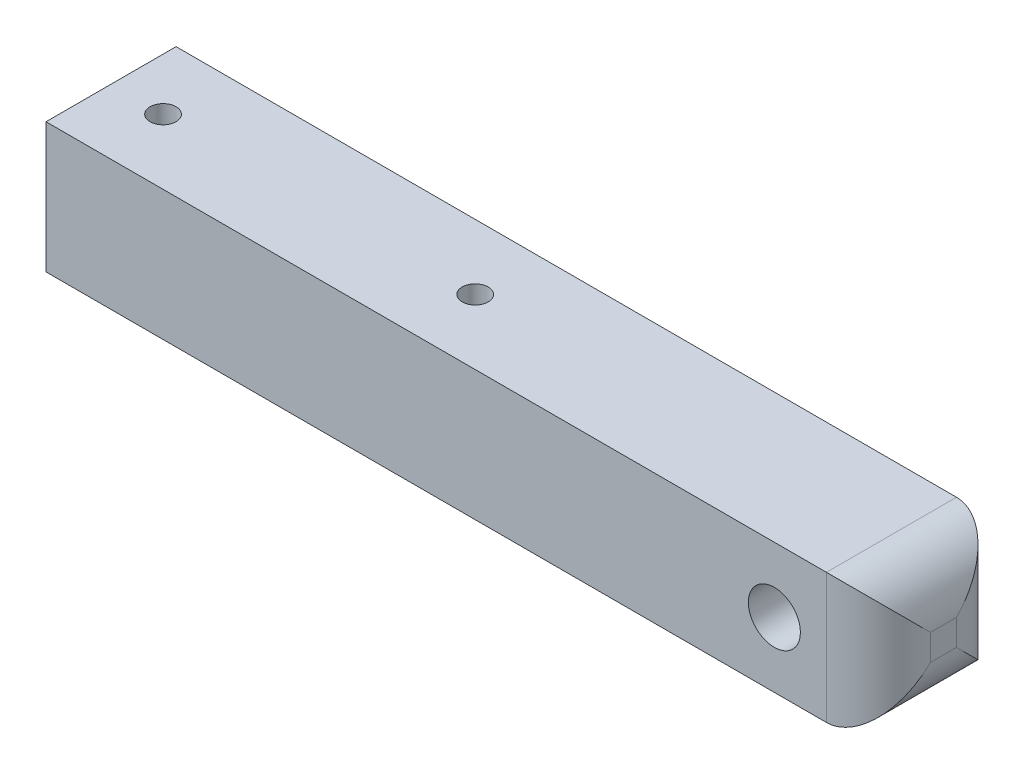
ISO-10303-21;
HEADER;
FILE_DESCRIPTION(('STEP AP214'),'2;1');
FILE_NAME('part.step','',(''),(''),'','','');
FILE_SCHEMA(('AUTOMOTIVE_DESIGN { 1 0 10303 214 1 1 1 1 }'));
ENDSEC;
DATA;
#1=APPLICATION_CONTEXT('core data for automotive mechanical design processes');
#2=APPLICATION_PROTOCOL_DEFINITION('international standard','automotive_design',2000,#1);
#3=PRODUCT_CONTEXT('',#1,'mechanical');
#4=PRODUCT('Part','Part','',(#3));
#5=PRODUCT_RELATED_PRODUCT_CATEGORY('part','',(#4));
#6=PRODUCT_DEFINITION_FORMATION('','',#4);
#7=PRODUCT_DEFINITION_CONTEXT('part definition',#1,'design');
#8=PRODUCT_DEFINITION('design','',#6,#7);
#9=PRODUCT_DEFINITION_SHAPE('','',#8);
#10=(LENGTH_UNIT() NAMED_UNIT(*) SI_UNIT(.MILLI.,.METRE.));
#11=(NAMED_UNIT(*) PLANE_ANGLE_UNIT() SI_UNIT($,.RADIAN.));
#12=(NAMED_UNIT(*) SI_UNIT($,.STERADIAN.) SOLID_ANGLE_UNIT());
#13=UNCERTAINTY_MEASURE_WITH_UNIT(LENGTH_MEASURE(1.E-05),#10,'distance_accuracy_value','');
#14=(GEOMETRIC_REPRESENTATION_CONTEXT(3) GLOBAL_UNCERTAINTY_ASSIGNED_CONTEXT((#13)) GLOBAL_UNIT_ASSIGNED_CONTEXT((#10,
#11,#12)) REPRESENTATION_CONTEXT('',''));
#15=CARTESIAN_POINT('',(0.,0.,0.));
#16=DIRECTION('',(0.,0.,1.));
#17=DIRECTION('',(1.,0.,0.));
#18=AXIS2_PLACEMENT_3D('',#15,#16,#17);
#19=CARTESIAN_POINT('',(0.,0.,15.875));
#20=DIRECTION('',(0.,1.,0.));
#21=DIRECTION('',(0.,0.,1.));
#22=AXIS2_PLACEMENT_3D('',#19,#20,#21);
#23=PLANE('',#22);
#24=CARTESIAN_POINT('',(-88.9,0.,0.));
#25=DIRECTION('',(0.,1.,0.));
#26=DIRECTION('',(0.,0.,1.));
#27=AXIS2_PLACEMENT_3D('',#24,#25,#26);
#28=CIRCLE('',#27,3.175);
#29=CARTESIAN_POINT('',(-88.9,0.,3.175));
#30=VERTEX_POINT('',#29);
#31=EDGE_CURVE('E166',#30,#30,#28,.T.);
#32=ORIENTED_EDGE('',*,*,#31,.T.);
#33=EDGE_LOOP('',(#32));
#34=FACE_BOUND('',#33,.T.);
#35=CARTESIAN_POINT('',(-12.7,0.,0.));
#36=DIRECTION('',(0.,1.,0.));
#37=DIRECTION('',(0.,0.,1.));
#38=AXIS2_PLACEMENT_3D('',#35,#36,#37);
#39=CIRCLE('',#38,3.17499999999999);
#40=CARTESIAN_POINT('',(-12.7,0.,3.17499999999999));
#41=VERTEX_POINT('',#40);
#42=EDGE_CURVE('E243',#41,#41,#39,.T.);
#43=ORIENTED_EDGE('',*,*,#42,.T.);
#44=EDGE_LOOP('',(#43));
#45=FACE_BOUND('',#44,.T.);
#46=DIRECTION('',(1.,0.,0.));
#47=VECTOR('',#46,1.);
#48=CARTESIAN_POINT('',(0.,0.,-15.875));
#49=LINE('',#48,#47);
#50=CARTESIAN_POINT('',(-101.6,0.,-15.875));
#51=VERTEX_POINT('',#50);
#52=CARTESIAN_POINT('',(88.9,0.,-15.875));
#53=VERTEX_POINT('',#52);
#54=EDGE_CURVE('E186',#51,#53,#49,.T.);
#55=ORIENTED_EDGE('',*,*,#54,.T.);
#56=DIRECTION('',(0.,0.,-1.));
#57=VECTOR('',#56,1.);
#58=CARTESIAN_POINT('',(88.9,0.,15.875));
#59=LINE('',#58,#57);
#60=CARTESIAN_POINT('',(88.9,0.,15.875));
#61=VERTEX_POINT('',#60);
#62=EDGE_CURVE('E208',#53,#61,#59,.F.);
#63=ORIENTED_EDGE('',*,*,#62,.T.);
#64=DIRECTION('',(1.,0.,0.));
#65=VECTOR('',#64,1.);
#66=CARTESIAN_POINT('',(-101.6,0.,15.875));
#67=LINE('',#66,#65);
#68=CARTESIAN_POINT('',(-101.6,0.,15.875));
#69=VERTEX_POINT('',#68);
#70=EDGE_CURVE('E178',#69,#61,#67,.T.);
#71=ORIENTED_EDGE('',*,*,#70,.F.);
#72=DIRECTION('',(0.,0.,-1.));
#73=VECTOR('',#72,1.);
#74=CARTESIAN_POINT('',(-101.6,0.,15.875));
#75=LINE('',#74,#73);
#76=EDGE_CURVE('E185',#69,#51,#75,.T.);
#77=ORIENTED_EDGE('',*,*,#76,.T.);
#78=EDGE_LOOP('',(#55,#63,#71,#77));
#79=FACE_BOUND('',#78,.T.);
#80=ADVANCED_FACE('F36',(#34,#45,#79),#23,.F.);
#81=CARTESIAN_POINT('',(101.6,0.,15.875));
#82=DIRECTION('',(-1.,0.,0.));
#83=DIRECTION('',(0.,0.,1.));
#84=AXIS2_PLACEMENT_3D('',#81,#82,#83);
#85=PLANE('',#84);
#86=DIRECTION('',(0.,1.,0.));
#87=VECTOR('',#86,1.);
#88=CARTESIAN_POINT('',(101.6,0.,3.175));
#89=LINE('',#88,#87);
#90=CARTESIAN_POINT('',(101.6,19.05,3.175));
#91=VERTEX_POINT('',#90);
#92=CARTESIAN_POINT('',(101.6,12.7,3.175));
#93=VERTEX_POINT('',#92);
#94=EDGE_CURVE('E155',#91,#93,#89,.F.);
#95=ORIENTED_EDGE('',*,*,#94,.T.);
#96=DIRECTION('',(0.,0.,-1.));
#97=VECTOR('',#96,1.);
#98=CARTESIAN_POINT('',(101.6,12.7,15.875));
#99=LINE('',#98,#97);
#100=CARTESIAN_POINT('',(101.6,12.7,-3.175));
#101=VERTEX_POINT('',#100);
#102=EDGE_CURVE('E205',#93,#101,#99,.T.);
#103=ORIENTED_EDGE('',*,*,#102,.T.);
#104=DIRECTION('',(0.,1.,0.));
#105=VECTOR('',#104,1.);
#106=CARTESIAN_POINT('',(101.6,0.,-3.175));
#107=LINE('',#106,#105);
#108=CARTESIAN_POINT('',(101.6,19.05,-3.175));
#109=VERTEX_POINT('',#108);
#110=EDGE_CURVE('E203',#101,#109,#107,.T.);
#111=ORIENTED_EDGE('',*,*,#110,.T.);
#112=DIRECTION('',(0.,0.,-1.));
#113=VECTOR('',#112,1.);
#114=CARTESIAN_POINT('',(101.6,19.05,15.875));
#115=LINE('',#114,#113);
#116=EDGE_CURVE('E201',#109,#91,#115,.F.);
#117=ORIENTED_EDGE('',*,*,#116,.T.);
#118=EDGE_LOOP('',(#95,#103,#111,#117));
#119=FACE_BOUND('',#118,.T.);
#120=ADVANCED_FACE('F338',(#119),#85,.F.);
#121=CARTESIAN_POINT('',(101.6,31.75,15.875));
#122=DIRECTION('',(0.,-1.,0.));
#123=DIRECTION('',(1.,0.,0.));
#124=AXIS2_PLACEMENT_3D('',#121,#122,#123);
#125=PLANE('',#124);
#126=CARTESIAN_POINT('',(-88.9,31.75,0.));
#127=DIRECTION('',(0.,1.,0.));
#128=DIRECTION('',(0.,0.,1.));
#129=AXIS2_PLACEMENT_3D('',#126,#127,#128);
#130=CIRCLE('',#129,3.175);
#131=CARTESIAN_POINT('',(-88.9,31.75,3.175));
#132=VERTEX_POINT('',#131);
#133=EDGE_CURVE('E224',#132,#132,#130,.T.);
#134=ORIENTED_EDGE('',*,*,#133,.F.);
#135=EDGE_LOOP('',(#134));
#136=FACE_BOUND('',#135,.T.);
#137=CARTESIAN_POINT('',(-12.7,31.75,0.));
#138=DIRECTION('',(0.,1.,0.));
#139=DIRECTION('',(0.,0.,1.));
#140=AXIS2_PLACEMENT_3D('',#137,#138,#139);
#141=CIRCLE('',#140,3.175);
#142=CARTESIAN_POINT('',(-12.7,31.75,3.175));
#143=VERTEX_POINT('',#142);
#144=EDGE_CURVE('E240',#143,#143,#141,.T.);
#145=ORIENTED_EDGE('',*,*,#144,.F.);
#146=EDGE_LOOP('',(#145));
#147=FACE_BOUND('',#146,.T.);
#148=DIRECTION('',(-1.,0.,0.));
#149=VECTOR('',#148,1.);
#150=CARTESIAN_POINT('',(101.6,31.75,15.875));
#151=LINE('',#150,#149);
#152=CARTESIAN_POINT('',(88.9,31.75,15.875));
#153=VERTEX_POINT('',#152);
#154=CARTESIAN_POINT('',(-101.6,31.75,15.875));
#155=VERTEX_POINT('',#154);
#156=EDGE_CURVE('E180',#153,#155,#151,.T.);
#157=ORIENTED_EDGE('',*,*,#156,.F.);
#158=DIRECTION('',(0.,0.,-1.));
#159=VECTOR('',#158,1.);
#160=CARTESIAN_POINT('',(88.9,31.75,15.875));
#161=LINE('',#160,#159);
#162=CARTESIAN_POINT('',(88.9,31.75,-15.875));
#163=VERTEX_POINT('',#162);
#164=EDGE_CURVE('E45',#153,#163,#161,.T.);
#165=ORIENTED_EDGE('',*,*,#164,.T.);
#166=DIRECTION('',(-1.,0.,0.));
#167=VECTOR('',#166,1.);
#168=CARTESIAN_POINT('',(101.6,31.75,-15.875));
#169=LINE('',#168,#167);
#170=CARTESIAN_POINT('',(-101.6,31.75,-15.875));
#171=VERTEX_POINT('',#170);
#172=EDGE_CURVE('E189',#163,#171,#169,.T.);
#173=ORIENTED_EDGE('',*,*,#172,.T.);
#174=DIRECTION('',(0.,0.,-1.));
#175=VECTOR('',#174,1.);
#176=CARTESIAN_POINT('',(-101.6,31.75,15.875));
#177=LINE('',#176,#175);
#178=EDGE_CURVE('E196',#155,#171,#177,.T.);
#179=ORIENTED_EDGE('',*,*,#178,.F.);
#180=EDGE_LOOP('',(#157,#165,#173,#179));
#181=FACE_BOUND('',#180,.T.);
#182=ADVANCED_FACE('F344',(#136,#147,#181),#125,.F.);
#183=CARTESIAN_POINT('',(-101.6,31.75,15.875));
#184=DIRECTION('',(1.,0.,0.));
#185=DIRECTION('',(0.,0.,-1.));
#186=AXIS2_PLACEMENT_3D('',#183,#184,#185);
#187=PLANE('',#186);
#188=DIRECTION('',(0.,0.707106781186548,-0.707106781186547));
#189=VECTOR('',#188,1.);
#190=CARTESIAN_POINT('',(-101.6,4.97105122421384,0.));
#191=LINE('',#190,#189);
#192=CARTESIAN_POINT('',(-101.6,4.97105122421384,0.));
#193=VERTEX_POINT('',#192);
#194=CARTESIAN_POINT('',(-101.6,13.951307345283,-8.98025612106916));
#195=VERTEX_POINT('',#194);
#196=EDGE_CURVE('E280',#193,#195,#191,.T.);
#197=ORIENTED_EDGE('',*,*,#196,.F.);
#198=DIRECTION('',(0.,-0.707106781186548,-0.707106781186547));
#199=VECTOR('',#198,1.);
#200=CARTESIAN_POINT('',(-101.6,13.951307345283,8.98025612106914));
#201=LINE('',#200,#199);
#202=CARTESIAN_POINT('',(-101.6,13.951307345283,8.98025612106914));
#203=VERTEX_POINT('',#202);
#204=EDGE_CURVE('E260',#203,#193,#201,.T.);
#205=ORIENTED_EDGE('',*,*,#204,.F.);
#206=DIRECTION('',(0.,0.707106781186549,-0.707106781186546));
#207=VECTOR('',#206,1.);
#208=CARTESIAN_POINT('',(-101.6,13.0532817331761,9.87828173317606));
#209=LINE('',#208,#207);
#210=CARTESIAN_POINT('',(-101.6,13.0532817331761,9.87828173317606));
#211=VERTEX_POINT('',#210);
#212=EDGE_CURVE('E265',#211,#203,#209,.T.);
#213=ORIENTED_EDGE('',*,*,#212,.F.);
#214=DIRECTION('',(0.,0.707106781186548,0.707106781186547));
#215=VECTOR('',#214,1.);
#216=CARTESIAN_POINT('',(-101.6,3.175,0.));
#217=LINE('',#216,#215);
#218=CARTESIAN_POINT('',(-101.6,3.175,0.));
#219=VERTEX_POINT('',#218);
#220=EDGE_CURVE('E289',#219,#211,#217,.T.);
#221=ORIENTED_EDGE('',*,*,#220,.F.);
#222=DIRECTION('',(0.,-0.707106781186548,0.707106781186547));
#223=VECTOR('',#222,1.);
#224=CARTESIAN_POINT('',(-101.6,13.0532817331761,-9.87828173317606));
#225=LINE('',#224,#223);
#226=CARTESIAN_POINT('',(-101.6,13.0532817331761,-9.87828173317606));
#227=VERTEX_POINT('',#226);
#228=EDGE_CURVE('E286',#227,#219,#225,.T.);
#229=ORIENTED_EDGE('',*,*,#228,.F.);
#230=DIRECTION('',(0.,-0.707106781186563,-0.707106781186532));
#231=VECTOR('',#230,1.);
#232=CARTESIAN_POINT('',(-101.6,13.951307345283,-8.98025612106916));
#233=LINE('',#232,#231);
#234=EDGE_CURVE('E283',#195,#227,#233,.T.);
#235=ORIENTED_EDGE('',*,*,#234,.F.);
#236=EDGE_LOOP('',(#197,#205,#213,#221,#229,#235));
#237=FACE_BOUND('',#236,.T.);
#238=DIRECTION('',(0.,-1.,0.));
#239=VECTOR('',#238,1.);
#240=CARTESIAN_POINT('',(-101.6,31.75,-15.875));
#241=LINE('',#240,#239);
#242=EDGE_CURVE('E181',#171,#51,#241,.T.);
#243=ORIENTED_EDGE('',*,*,#242,.T.);
#244=ORIENTED_EDGE('',*,*,#76,.F.);
#245=DIRECTION('',(0.,-1.,0.));
#246=VECTOR('',#245,1.);
#247=CARTESIAN_POINT('',(-101.6,31.75,15.875));
#248=LINE('',#247,#246);
#249=EDGE_CURVE('E183',#155,#69,#248,.T.);
#250=ORIENTED_EDGE('',*,*,#249,.F.);
#251=ORIENTED_EDGE('',*,*,#178,.T.);
#252=EDGE_LOOP('',(#243,#244,#250,#251));
#253=FACE_BOUND('',#252,.T.);
#254=ADVANCED_FACE('F313',(#237,#253),#187,.F.);
#255=CARTESIAN_POINT('',(0.,0.,15.875));
#256=DIRECTION('',(0.,0.,1.));
#257=DIRECTION('',(1.,0.,0.));
#258=AXIS2_PLACEMENT_3D('',#255,#256,#257);
#259=PLANE('',#258);
#260=CARTESIAN_POINT('',(76.2,15.875,15.875));
#261=DIRECTION('',(0.,0.,1.));
#262=DIRECTION('',(1.,0.,0.));
#263=AXIS2_PLACEMENT_3D('',#260,#261,#262);
#264=CIRCLE('',#263,6.34999999999999);
#265=CARTESIAN_POINT('',(82.55,15.875,15.875));
#266=VERTEX_POINT('',#265);
#267=EDGE_CURVE('E254',#266,#266,#264,.T.);
#268=ORIENTED_EDGE('',*,*,#267,.F.);
#269=EDGE_LOOP('',(#268));
#270=FACE_BOUND('',#269,.T.);
#271=ORIENTED_EDGE('',*,*,#70,.T.);
#272=DIRECTION('',(0.,1.,0.));
#273=VECTOR('',#272,1.);
#274=CARTESIAN_POINT('',(88.9,31.75,15.875));
#275=LINE('',#274,#273);
#276=EDGE_CURVE('E11',#61,#153,#275,.T.);
#277=ORIENTED_EDGE('',*,*,#276,.T.);
#278=ORIENTED_EDGE('',*,*,#156,.T.);
#279=ORIENTED_EDGE('',*,*,#249,.T.);
#280=EDGE_LOOP('',(#271,#277,#278,#279));
#281=FACE_BOUND('',#280,.T.);
#282=ADVANCED_FACE('F475',(#270,#281),#259,.T.);
#283=CARTESIAN_POINT('',(0.,0.,-15.875));
#284=DIRECTION('',(0.,0.,1.));
#285=DIRECTION('',(1.,0.,0.));
#286=AXIS2_PLACEMENT_3D('',#283,#284,#285);
#287=PLANE('',#286);
#288=CARTESIAN_POINT('',(76.2,15.875,-15.875));
#289=DIRECTION('',(0.,0.,1.));
#290=DIRECTION('',(1.,0.,0.));
#291=AXIS2_PLACEMENT_3D('',#288,#289,#290);
#292=CIRCLE('',#291,6.34999999999999);
#293=CARTESIAN_POINT('',(82.55,15.875,-15.875));
#294=VERTEX_POINT('',#293);
#295=EDGE_CURVE('E257',#294,#294,#292,.T.);
#296=ORIENTED_EDGE('',*,*,#295,.T.);
#297=EDGE_LOOP('',(#296));
#298=FACE_BOUND('',#297,.T.);
#299=ORIENTED_EDGE('',*,*,#172,.F.);
#300=DIRECTION('',(0.,1.,0.));
#301=VECTOR('',#300,1.);
#302=CARTESIAN_POINT('',(88.9,0.,-15.875));
#303=LINE('',#302,#301);
#304=EDGE_CURVE('E211',#163,#53,#303,.F.);
#305=ORIENTED_EDGE('',*,*,#304,.T.);
#306=ORIENTED_EDGE('',*,*,#54,.F.);
#307=ORIENTED_EDGE('',*,*,#242,.F.);
#308=EDGE_LOOP('',(#299,#305,#306,#307));
#309=FACE_BOUND('',#308,.T.);
#310=ADVANCED_FACE('F468',(#298,#309),#287,.F.);
#311=CARTESIAN_POINT('',(50.8,13.951307345283,8.98025612106914));
#312=DIRECTION('',(0.,0.707106781186547,-0.707106781186548));
#313=DIRECTION('',(0.,0.707106781186548,0.707106781186547));
#314=AXIS2_PLACEMENT_3D('',#311,#312,#313);
#315=PLANE('',#314);
#316=DIRECTION('',(-1.,0.,0.));
#317=VECTOR('',#316,1.);
#318=CARTESIAN_POINT('',(50.8,4.97105122421384,0.));
#319=LINE('',#318,#317);
#320=CARTESIAN_POINT('',(-92.0749999999999,4.97105122421384,0.));
#321=VERTEX_POINT('',#320);
#322=EDGE_CURVE('E164',#321,#193,#319,.T.);
#323=ORIENTED_EDGE('',*,*,#322,.F.);
#324=CARTESIAN_POINT('',(-88.9,4.97105122421384,0.));
#325=DIRECTION('',(0.,0.707106781186547,-0.707106781186548));
#326=DIRECTION('',(0.,0.707106781186548,0.707106781186547));
#327=AXIS2_PLACEMENT_3D('',#324,#325,#326);
#328=ELLIPSE('',#327,4.49012806053458,3.175);
#329=CARTESIAN_POINT('',(-85.7249999999999,4.97105122421384,0.));
#330=VERTEX_POINT('',#329);
#331=EDGE_CURVE('E151',#321,#330,#328,.T.);
#332=ORIENTED_EDGE('',*,*,#331,.T.);
#333=CARTESIAN_POINT('',(-15.875,4.97105122421384,0.));
#334=VERTEX_POINT('',#333);
#335=EDGE_CURVE('E162',#334,#330,#319,.T.);
#336=ORIENTED_EDGE('',*,*,#335,.F.);
#337=CARTESIAN_POINT('',(-12.7,4.97105122421384,0.));
#338=DIRECTION('',(0.,0.707106781186547,-0.707106781186548));
#339=DIRECTION('',(0.,0.707106781186548,0.707106781186547));
#340=AXIS2_PLACEMENT_3D('',#337,#338,#339);
#341=ELLIPSE('',#340,4.49012806053457,3.17499999999999);
#342=CARTESIAN_POINT('',(-9.52499999999997,4.97105122421384,0.));
#343=VERTEX_POINT('',#342);
#344=EDGE_CURVE('E246',#334,#343,#341,.T.);
#345=ORIENTED_EDGE('',*,*,#344,.T.);
#346=CARTESIAN_POINT('',(50.8,4.97105122421384,0.));
#347=VERTEX_POINT('',#346);
#348=EDGE_CURVE('E171',#347,#343,#319,.T.);
#349=ORIENTED_EDGE('',*,*,#348,.F.);
#350=DIRECTION('',(0.,-0.707106781186548,-0.707106781186547));
#351=VECTOR('',#350,1.);
#352=CARTESIAN_POINT('',(50.8,13.951307345283,8.98025612106914));
#353=LINE('',#352,#351);
#354=CARTESIAN_POINT('',(50.8,13.951307345283,8.98025612106914));
#355=VERTEX_POINT('',#354);
#356=EDGE_CURVE('E261',#355,#347,#353,.T.);
#357=ORIENTED_EDGE('',*,*,#356,.F.);
#358=DIRECTION('',(-1.,0.,0.));
#359=VECTOR('',#358,1.);
#360=CARTESIAN_POINT('',(50.8,13.951307345283,8.98025612106914));
#361=LINE('',#360,#359);
#362=EDGE_CURVE('E190',#355,#203,#361,.T.);
#363=ORIENTED_EDGE('',*,*,#362,.T.);
#364=ORIENTED_EDGE('',*,*,#204,.T.);
#365=EDGE_LOOP('',(#323,#332,#336,#345,#349,#357,#363,#364));
#366=FACE_BOUND('',#365,.T.);
#367=ADVANCED_FACE('F160',(#366),#315,.F.);
#368=CARTESIAN_POINT('',(50.8,13.0532817331761,9.87828173317606));
#369=DIRECTION('',(0.,0.707106781186546,0.707106781186549));
#370=DIRECTION('',(0.,-0.707106781186549,0.707106781186546));
#371=AXIS2_PLACEMENT_3D('',#368,#369,#370);
#372=PLANE('',#371);
#373=ORIENTED_EDGE('',*,*,#212,.T.);
#374=ORIENTED_EDGE('',*,*,#362,.F.);
#375=DIRECTION('',(0.,0.707106781186549,-0.707106781186546));
#376=VECTOR('',#375,1.);
#377=CARTESIAN_POINT('',(50.8,13.0532817331761,9.87828173317606));
#378=LINE('',#377,#376);
#379=CARTESIAN_POINT('',(50.8,13.0532817331761,9.87828173317606));
#380=VERTEX_POINT('',#379);
#381=EDGE_CURVE('E174',#380,#355,#378,.T.);
#382=ORIENTED_EDGE('',*,*,#381,.F.);
#383=DIRECTION('',(-1.,0.,0.));
#384=VECTOR('',#383,1.);
#385=CARTESIAN_POINT('',(50.8,13.0532817331761,9.87828173317606));
#386=LINE('',#385,#384);
#387=EDGE_CURVE('E295',#380,#211,#386,.T.);
#388=ORIENTED_EDGE('',*,*,#387,.T.);
#389=EDGE_LOOP('',(#373,#374,#382,#388));
#390=FACE_BOUND('',#389,.T.);
#391=ADVANCED_FACE('F453',(#390),#372,.F.);
#392=CARTESIAN_POINT('',(50.8,3.175,0.));
#393=DIRECTION('',(0.,-0.707106781186547,0.707106781186548));
#394=DIRECTION('',(0.,-0.707106781186548,-0.707106781186547));
#395=AXIS2_PLACEMENT_3D('',#392,#393,#394);
#396=PLANE('',#395);
#397=DIRECTION('',(-1.,0.,0.));
#398=VECTOR('',#397,1.);
#399=CARTESIAN_POINT('',(50.8,3.175,0.));
#400=LINE('',#399,#398);
#401=CARTESIAN_POINT('',(-15.8749999999999,3.175,0.));
#402=VERTEX_POINT('',#401);
#403=CARTESIAN_POINT('',(-85.7249999999999,3.175,0.));
#404=VERTEX_POINT('',#403);
#405=EDGE_CURVE('E299',#402,#404,#400,.T.);
#406=ORIENTED_EDGE('',*,*,#405,.T.);
#407=CARTESIAN_POINT('',(-88.9,3.175,0.));
#408=DIRECTION('',(0.,-0.707106781186547,0.707106781186548));
#409=DIRECTION('',(0.,0.707106781186548,0.707106781186547));
#410=AXIS2_PLACEMENT_3D('',#407,#408,#409);
#411=ELLIPSE('',#410,4.49012806053458,3.175);
#412=CARTESIAN_POINT('',(-92.0749999999999,3.175,0.));
#413=VERTEX_POINT('',#412);
#414=EDGE_CURVE('E237',#404,#413,#411,.T.);
#415=ORIENTED_EDGE('',*,*,#414,.T.);
#416=EDGE_CURVE('E300',#413,#219,#400,.T.);
#417=ORIENTED_EDGE('',*,*,#416,.T.);
#418=ORIENTED_EDGE('',*,*,#220,.T.);
#419=ORIENTED_EDGE('',*,*,#387,.F.);
#420=DIRECTION('',(0.,0.707106781186548,0.707106781186547));
#421=VECTOR('',#420,1.);
#422=CARTESIAN_POINT('',(50.8,3.175,0.));
#423=LINE('',#422,#421);
#424=CARTESIAN_POINT('',(50.8,3.175,0.));
#425=VERTEX_POINT('',#424);
#426=EDGE_CURVE('E274',#425,#380,#423,.T.);
#427=ORIENTED_EDGE('',*,*,#426,.F.);
#428=CARTESIAN_POINT('',(-9.52499999999996,3.175,0.));
#429=VERTEX_POINT('',#428);
#430=EDGE_CURVE('E297',#425,#429,#400,.T.);
#431=ORIENTED_EDGE('',*,*,#430,.T.);
#432=CARTESIAN_POINT('',(-12.7,3.175,0.));
#433=DIRECTION('',(0.,-0.707106781186547,0.707106781186548));
#434=DIRECTION('',(0.,0.707106781186548,0.707106781186547));
#435=AXIS2_PLACEMENT_3D('',#432,#433,#434);
#436=ELLIPSE('',#435,4.49012806053457,3.17499999999999);
#437=EDGE_CURVE('E251',#429,#402,#436,.T.);
#438=ORIENTED_EDGE('',*,*,#437,.T.);
#439=EDGE_LOOP('',(#406,#415,#417,#418,#419,#427,#431,#438));
#440=FACE_BOUND('',#439,.T.);
#441=ADVANCED_FACE('F322',(#440),#396,.F.);
#442=CARTESIAN_POINT('',(50.8,13.0532817331761,-9.87828173317606));
#443=DIRECTION('',(0.,-0.707106781186547,-0.707106781186548));
#444=DIRECTION('',(0.,0.707106781186548,-0.707106781186547));
#445=AXIS2_PLACEMENT_3D('',#442,#443,#444);
#446=PLANE('',#445);
#447=ORIENTED_EDGE('',*,*,#416,.F.);
#448=CARTESIAN_POINT('',(-88.9,3.175,0.));
#449=DIRECTION('',(0.,-0.707106781186547,-0.707106781186548));
#450=DIRECTION('',(0.,0.707106781186548,-0.707106781186547));
#451=AXIS2_PLACEMENT_3D('',#448,#449,#450);
#452=ELLIPSE('',#451,4.49012806053458,3.175);
#453=EDGE_CURVE('E165',#413,#404,#452,.T.);
#454=ORIENTED_EDGE('',*,*,#453,.T.);
#455=ORIENTED_EDGE('',*,*,#405,.F.);
#456=CARTESIAN_POINT('',(-12.7,3.175,0.));
#457=DIRECTION('',(0.,-0.707106781186547,-0.707106781186548));
#458=DIRECTION('',(0.,0.707106781186548,-0.707106781186547));
#459=AXIS2_PLACEMENT_3D('',#456,#457,#458);
#460=ELLIPSE('',#459,4.49012806053457,3.17499999999999);
#461=EDGE_CURVE('E248',#402,#429,#460,.T.);
#462=ORIENTED_EDGE('',*,*,#461,.T.);
#463=ORIENTED_EDGE('',*,*,#430,.F.);
#464=DIRECTION('',(0.,-0.707106781186548,0.707106781186547));
#465=VECTOR('',#464,1.);
#466=CARTESIAN_POINT('',(50.8,13.0532817331761,-9.87828173317606));
#467=LINE('',#466,#465);
#468=CARTESIAN_POINT('',(50.8,13.0532817331761,-9.87828173317606));
#469=VERTEX_POINT('',#468);
#470=EDGE_CURVE('E271',#469,#425,#467,.T.);
#471=ORIENTED_EDGE('',*,*,#470,.F.);
#472=DIRECTION('',(-1.,0.,0.));
#473=VECTOR('',#472,1.);
#474=CARTESIAN_POINT('',(50.8,13.0532817331761,-9.87828173317606));
#475=LINE('',#474,#473);
#476=EDGE_CURVE('E301',#469,#227,#475,.T.);
#477=ORIENTED_EDGE('',*,*,#476,.T.);
#478=ORIENTED_EDGE('',*,*,#228,.T.);
#479=EDGE_LOOP('',(#447,#454,#455,#462,#463,#471,#477,#478));
#480=FACE_BOUND('',#479,.T.);
#481=ADVANCED_FACE('F318',(#480),#446,.F.);
#482=CARTESIAN_POINT('',(50.8,13.951307345283,-8.98025612106916));
#483=DIRECTION('',(0.,0.707106781186532,-0.707106781186563));
#484=DIRECTION('',(0.,0.707106781186563,0.707106781186532));
#485=AXIS2_PLACEMENT_3D('',#482,#483,#484);
#486=PLANE('',#485);
#487=ORIENTED_EDGE('',*,*,#234,.T.);
#488=ORIENTED_EDGE('',*,*,#476,.F.);
#489=DIRECTION('',(0.,-0.707106781186563,-0.707106781186532));
#490=VECTOR('',#489,1.);
#491=CARTESIAN_POINT('',(50.8,13.951307345283,-8.98025612106916));
#492=LINE('',#491,#490);
#493=CARTESIAN_POINT('',(50.8,13.951307345283,-8.98025612106916));
#494=VERTEX_POINT('',#493);
#495=EDGE_CURVE('E268',#494,#469,#492,.T.);
#496=ORIENTED_EDGE('',*,*,#495,.F.);
#497=DIRECTION('',(-1.,0.,0.));
#498=VECTOR('',#497,1.);
#499=CARTESIAN_POINT('',(50.8,13.951307345283,-8.98025612106916));
#500=LINE('',#499,#498);
#501=EDGE_CURVE('E173',#494,#195,#500,.T.);
#502=ORIENTED_EDGE('',*,*,#501,.T.);
#503=EDGE_LOOP('',(#487,#488,#496,#502));
#504=FACE_BOUND('',#503,.T.);
#505=ADVANCED_FACE('F306',(#504),#486,.F.);
#506=CARTESIAN_POINT('',(50.8,4.97105122421384,0.));
#507=DIRECTION('',(0.,0.707106781186547,0.707106781186548));
#508=DIRECTION('',(0.,-0.707106781186548,0.707106781186547));
#509=AXIS2_PLACEMENT_3D('',#506,#507,#508);
#510=PLANE('',#509);
#511=ORIENTED_EDGE('',*,*,#335,.T.);
#512=CARTESIAN_POINT('',(-88.9,4.97105122421383,0.));
#513=DIRECTION('',(0.,0.707106781186547,0.707106781186548));
#514=DIRECTION('',(0.,0.707106781186548,-0.707106781186547));
#515=AXIS2_PLACEMENT_3D('',#512,#513,#514);
#516=ELLIPSE('',#515,4.49012806053458,3.175);
#517=EDGE_CURVE('E148',#330,#321,#516,.T.);
#518=ORIENTED_EDGE('',*,*,#517,.T.);
#519=ORIENTED_EDGE('',*,*,#322,.T.);
#520=ORIENTED_EDGE('',*,*,#196,.T.);
#521=ORIENTED_EDGE('',*,*,#501,.F.);
#522=DIRECTION('',(0.,0.707106781186548,-0.707106781186547));
#523=VECTOR('',#522,1.);
#524=CARTESIAN_POINT('',(50.8,4.97105122421384,0.));
#525=LINE('',#524,#523);
#526=EDGE_CURVE('E264',#347,#494,#525,.T.);
#527=ORIENTED_EDGE('',*,*,#526,.F.);
#528=ORIENTED_EDGE('',*,*,#348,.T.);
#529=CARTESIAN_POINT('',(-12.7,4.97105122421383,0.));
#530=DIRECTION('',(0.,0.707106781186547,0.707106781186548));
#531=DIRECTION('',(0.,0.707106781186548,-0.707106781186547));
#532=AXIS2_PLACEMENT_3D('',#529,#530,#531);
#533=ELLIPSE('',#532,4.49012806053457,3.17499999999999);
#534=EDGE_CURVE('E156',#343,#334,#533,.T.);
#535=ORIENTED_EDGE('',*,*,#534,.T.);
#536=EDGE_LOOP('',(#511,#518,#519,#520,#521,#527,#528,#535));
#537=FACE_BOUND('',#536,.T.);
#538=ADVANCED_FACE('F169',(#537),#510,.F.);
#539=CARTESIAN_POINT('',(50.8,0.,0.));
#540=DIRECTION('',(1.,0.,0.));
#541=DIRECTION('',(0.,0.,-1.));
#542=AXIS2_PLACEMENT_3D('',#539,#540,#541);
#543=PLANE('',#542);
#544=ORIENTED_EDGE('',*,*,#356,.T.);
#545=ORIENTED_EDGE('',*,*,#526,.T.);
#546=ORIENTED_EDGE('',*,*,#495,.T.);
#547=ORIENTED_EDGE('',*,*,#470,.T.);
#548=ORIENTED_EDGE('',*,*,#426,.T.);
#549=ORIENTED_EDGE('',*,*,#381,.T.);
#550=EDGE_LOOP('',(#544,#545,#546,#547,#548,#549));
#551=FACE_BOUND('',#550,.T.);
#552=ADVANCED_FACE('F414',(#551),#543,.F.);
#553=CARTESIAN_POINT('',(76.2,15.875,15.875));
#554=DIRECTION('',(0.,0.,1.));
#555=DIRECTION('',(1.,0.,0.));
#556=AXIS2_PLACEMENT_3D('',#553,#554,#555);
#557=CYLINDRICAL_SURFACE('',#556,6.34999999999999);
#558=ORIENTED_EDGE('',*,*,#295,.F.);
#559=EDGE_LOOP('',(#558));
#560=FACE_BOUND('',#559,.T.);
#561=ORIENTED_EDGE('',*,*,#267,.T.);
#562=EDGE_LOOP('',(#561));
#563=FACE_BOUND('',#562,.T.);
#564=ADVANCED_FACE('F405',(#560,#563),#557,.F.);
#565=CARTESIAN_POINT('',(-12.7,31.75,0.));
#566=DIRECTION('',(0.,1.,0.));
#567=DIRECTION('',(0.,0.,1.));
#568=AXIS2_PLACEMENT_3D('',#565,#566,#567);
#569=CYLINDRICAL_SURFACE('',#568,3.17499999999999);
#570=ORIENTED_EDGE('',*,*,#144,.T.);
#571=EDGE_LOOP('',(#570));
#572=FACE_BOUND('',#571,.T.);
#573=ORIENTED_EDGE('',*,*,#534,.F.);
#574=ORIENTED_EDGE('',*,*,#344,.F.);
#575=EDGE_LOOP('',(#573,#574));
#576=FACE_BOUND('',#575,.T.);
#577=ADVANCED_FACE('F397',(#572,#576),#569,.F.);
#578=ORIENTED_EDGE('',*,*,#42,.F.);
#579=EDGE_LOOP('',(#578));
#580=FACE_BOUND('',#579,.T.);
#581=ORIENTED_EDGE('',*,*,#461,.F.);
#582=ORIENTED_EDGE('',*,*,#437,.F.);
#583=EDGE_LOOP('',(#581,#582));
#584=FACE_BOUND('',#583,.T.);
#585=ADVANCED_FACE('F334',(#580,#584),#569,.F.);
#586=CARTESIAN_POINT('',(-88.9,31.75,0.));
#587=DIRECTION('',(0.,1.,0.));
#588=DIRECTION('',(0.,0.,1.));
#589=AXIS2_PLACEMENT_3D('',#586,#587,#588);
#590=CYLINDRICAL_SURFACE('',#589,3.175);
#591=ORIENTED_EDGE('',*,*,#133,.T.);
#592=EDGE_LOOP('',(#591));
#593=FACE_BOUND('',#592,.T.);
#594=ORIENTED_EDGE('',*,*,#517,.F.);
#595=ORIENTED_EDGE('',*,*,#331,.F.);
#596=EDGE_LOOP('',(#594,#595));
#597=FACE_BOUND('',#596,.T.);
#598=ADVANCED_FACE('F150',(#593,#597),#590,.F.);
#599=ORIENTED_EDGE('',*,*,#31,.F.);
#600=EDGE_LOOP('',(#599));
#601=FACE_BOUND('',#600,.T.);
#602=ORIENTED_EDGE('',*,*,#453,.F.);
#603=ORIENTED_EDGE('',*,*,#414,.F.);
#604=EDGE_LOOP('',(#602,#603));
#605=FACE_BOUND('',#604,.T.);
#606=ADVANCED_FACE('F324',(#601,#605),#590,.F.);
#607=CARTESIAN_POINT('',(88.9,19.05,15.875));
#608=DIRECTION('',(0.,0.,-1.));
#609=DIRECTION('',(-1.,0.,0.));
#610=AXIS2_PLACEMENT_3D('',#607,#608,#609);
#611=CYLINDRICAL_SURFACE('',#610,12.7);
#612=CARTESIAN_POINT('',(88.9,19.05,-3.175));
#613=DIRECTION('',(0.,-0.707106781186547,-0.707106781186547));
#614=DIRECTION('',(0.,0.707106781186547,-0.707106781186547));
#615=AXIS2_PLACEMENT_3D('',#612,#613,#614);
#616=ELLIPSE('',#615,17.9605122421383,12.7);
#617=EDGE_CURVE('E217',#163,#109,#616,.T.);
#618=ORIENTED_EDGE('',*,*,#617,.F.);
#619=ORIENTED_EDGE('',*,*,#164,.F.);
#620=CARTESIAN_POINT('',(88.9,19.05,3.175));
#621=DIRECTION('',(0.,-0.707106781186547,0.707106781186547));
#622=DIRECTION('',(0.,-0.707106781186547,-0.707106781186547));
#623=AXIS2_PLACEMENT_3D('',#620,#621,#622);
#624=ELLIPSE('',#623,17.9605122421383,12.7);
#625=EDGE_CURVE('E40',#91,#153,#624,.T.);
#626=ORIENTED_EDGE('',*,*,#625,.F.);
#627=ORIENTED_EDGE('',*,*,#116,.F.);
#628=EDGE_LOOP('',(#618,#619,#626,#627));
#629=FACE_BOUND('',#628,.T.);
#630=ADVANCED_FACE('F38',(#629),#611,.T.);
#631=CARTESIAN_POINT('',(88.9,0.,3.175));
#632=DIRECTION('',(0.,-1.,0.));
#633=DIRECTION('',(0.,0.,-1.));
#634=AXIS2_PLACEMENT_3D('',#631,#632,#633);
#635=CYLINDRICAL_SURFACE('',#634,12.7);
#636=ORIENTED_EDGE('',*,*,#625,.T.);
#637=ORIENTED_EDGE('',*,*,#276,.F.);
#638=CARTESIAN_POINT('',(88.9,12.7,3.175));
#639=DIRECTION('',(0.,-0.707106781186547,-0.707106781186547));
#640=DIRECTION('',(0.,-0.707106781186547,0.707106781186547));
#641=AXIS2_PLACEMENT_3D('',#638,#639,#640);
#642=ELLIPSE('',#641,17.9605122421383,12.7);
#643=EDGE_CURVE('E216',#93,#61,#642,.T.);
#644=ORIENTED_EDGE('',*,*,#643,.F.);
#645=ORIENTED_EDGE('',*,*,#94,.F.);
#646=EDGE_LOOP('',(#636,#637,#644,#645));
#647=FACE_BOUND('',#646,.T.);
#648=ADVANCED_FACE('F332',(#647),#635,.T.);
#649=CARTESIAN_POINT('',(88.9,0.,-3.175));
#650=DIRECTION('',(0.,1.,0.));
#651=DIRECTION('',(0.,0.,1.));
#652=AXIS2_PLACEMENT_3D('',#649,#650,#651);
#653=CYLINDRICAL_SURFACE('',#652,12.7);
#654=ORIENTED_EDGE('',*,*,#617,.T.);
#655=ORIENTED_EDGE('',*,*,#110,.F.);
#656=CARTESIAN_POINT('',(88.9,12.7,-3.175));
#657=DIRECTION('',(0.,0.707106781186547,-0.707106781186547));
#658=DIRECTION('',(0.,0.707106781186547,0.707106781186547));
#659=AXIS2_PLACEMENT_3D('',#656,#657,#658);
#660=ELLIPSE('',#659,17.9605122421383,12.7);
#661=EDGE_CURVE('E214',#53,#101,#660,.F.);
#662=ORIENTED_EDGE('',*,*,#661,.F.);
#663=ORIENTED_EDGE('',*,*,#304,.F.);
#664=EDGE_LOOP('',(#654,#655,#662,#663));
#665=FACE_BOUND('',#664,.T.);
#666=ADVANCED_FACE('F353',(#665),#653,.T.);
#667=CARTESIAN_POINT('',(88.9,12.7,15.875));
#668=DIRECTION('',(0.,0.,-1.));
#669=DIRECTION('',(-1.,0.,0.));
#670=AXIS2_PLACEMENT_3D('',#667,#668,#669);
#671=CYLINDRICAL_SURFACE('',#670,12.7);
#672=ORIENTED_EDGE('',*,*,#643,.T.);
#673=ORIENTED_EDGE('',*,*,#62,.F.);
#674=ORIENTED_EDGE('',*,*,#661,.T.);
#675=ORIENTED_EDGE('',*,*,#102,.F.);
#676=EDGE_LOOP('',(#672,#673,#674,#675));
#677=FACE_BOUND('',#676,.T.);
#678=ADVANCED_FACE('F350',(#677),#671,.T.);
#679=CLOSED_SHELL('',(#80,#120,#182,#254,#282,#310,#367,#391,#441,#481,#505,#538,#552,#564,#577,
#585,#598,#606,#630,#648,#666,#678));
#680=MANIFOLD_SOLID_BREP('B2',#679);
#681=ADVANCED_BREP_SHAPE_REPRESENTATION('',(#18,#680),#14);
#682=SHAPE_DEFINITION_REPRESENTATION(#9,#681);
ENDSEC;
END-ISO-10303-21;
